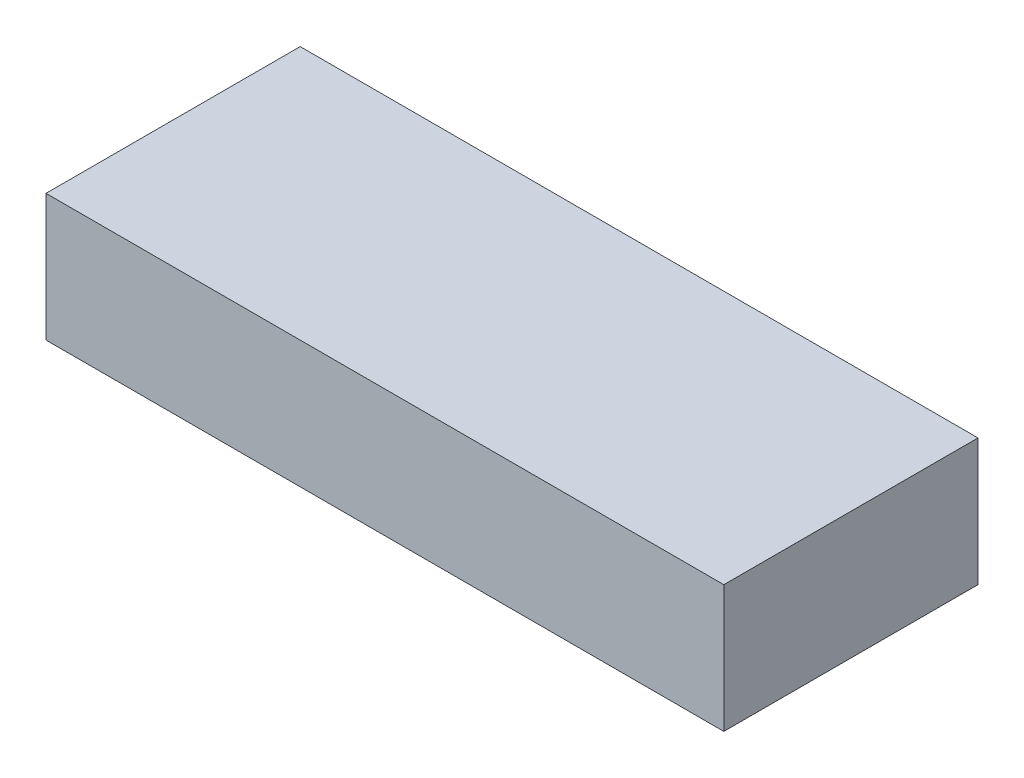
ISO-10303-21;
HEADER;
FILE_DESCRIPTION(('STEP AP214'),'2;1');
FILE_NAME('part.step','',(''),(''),'','','');
FILE_SCHEMA(('AUTOMOTIVE_DESIGN { 1 0 10303 214 1 1 1 1 }'));
ENDSEC;
DATA;
#1=APPLICATION_CONTEXT('core data for automotive mechanical design processes');
#2=APPLICATION_PROTOCOL_DEFINITION('international standard','automotive_design',2000,#1);
#3=PRODUCT_CONTEXT('',#1,'mechanical');
#4=PRODUCT('Part','Part','',(#3));
#5=PRODUCT_RELATED_PRODUCT_CATEGORY('part','',(#4));
#6=PRODUCT_DEFINITION_FORMATION('','',#4);
#7=PRODUCT_DEFINITION_CONTEXT('part definition',#1,'design');
#8=PRODUCT_DEFINITION('design','',#6,#7);
#9=PRODUCT_DEFINITION_SHAPE('','',#8);
#10=(LENGTH_UNIT() NAMED_UNIT(*) SI_UNIT(.MILLI.,.METRE.));
#11=(NAMED_UNIT(*) PLANE_ANGLE_UNIT() SI_UNIT($,.RADIAN.));
#12=(NAMED_UNIT(*) SI_UNIT($,.STERADIAN.) SOLID_ANGLE_UNIT());
#13=UNCERTAINTY_MEASURE_WITH_UNIT(LENGTH_MEASURE(1.E-05),#10,'distance_accuracy_value','');
#14=(GEOMETRIC_REPRESENTATION_CONTEXT(3) GLOBAL_UNCERTAINTY_ASSIGNED_CONTEXT((#13)) GLOBAL_UNIT_ASSIGNED_CONTEXT((#10,
#11,#12)) REPRESENTATION_CONTEXT('',''));
#15=CARTESIAN_POINT('',(0.,0.,0.));
#16=DIRECTION('',(0.,0.,1.));
#17=DIRECTION('',(1.,0.,0.));
#18=AXIS2_PLACEMENT_3D('',#15,#16,#17);
#19=CARTESIAN_POINT('',(4.,23.25,-17.));
#20=DIRECTION('',(0.,0.,1.));
#21=DIRECTION('',(1.,0.,0.));
#22=AXIS2_PLACEMENT_3D('',#19,#20,#21);
#23=PLANE('',#22);
#24=DIRECTION('',(-1.,0.,0.));
#25=VECTOR('',#24,1.);
#26=CARTESIAN_POINT('',(4.,21.75,-17.));
#27=LINE('',#26,#25);
#28=CARTESIAN_POINT('',(4.,21.75,-17.));
#29=VERTEX_POINT('',#28);
#30=CARTESIAN_POINT('',(-4.,21.75,-17.));
#31=VERTEX_POINT('',#30);
#32=EDGE_CURVE('E108',#29,#31,#27,.T.);
#33=ORIENTED_EDGE('',*,*,#32,.T.);
#34=DIRECTION('',(0.,-1.,0.));
#35=VECTOR('',#34,1.);
#36=CARTESIAN_POINT('',(-4.,23.25,-17.));
#37=LINE('',#36,#35);
#38=CARTESIAN_POINT('',(-4.,23.25,-17.));
#39=VERTEX_POINT('',#38);
#40=EDGE_CURVE('E11',#39,#31,#37,.T.);
#41=ORIENTED_EDGE('',*,*,#40,.F.);
#42=DIRECTION('',(-1.,0.,0.));
#43=VECTOR('',#42,1.);
#44=CARTESIAN_POINT('',(4.,23.25,-17.));
#45=LINE('',#44,#43);
#46=CARTESIAN_POINT('',(4.,23.25,-17.));
#47=VERTEX_POINT('',#46);
#48=EDGE_CURVE('E91',#47,#39,#45,.T.);
#49=ORIENTED_EDGE('',*,*,#48,.F.);
#50=DIRECTION('',(0.,-1.,0.));
#51=VECTOR('',#50,1.);
#52=CARTESIAN_POINT('',(4.,23.25,-17.));
#53=LINE('',#52,#51);
#54=EDGE_CURVE('E104',#47,#29,#53,.T.);
#55=ORIENTED_EDGE('',*,*,#54,.T.);
#56=EDGE_LOOP('',(#33,#41,#49,#55));
#57=FACE_BOUND('',#56,.T.);
#58=ADVANCED_FACE('F17',(#57),#23,.F.);
#59=CARTESIAN_POINT('',(-4.,23.25,-17.));
#60=DIRECTION('',(1.,0.,0.));
#61=DIRECTION('',(0.,0.,-1.));
#62=AXIS2_PLACEMENT_3D('',#59,#60,#61);
#63=PLANE('',#62);
#64=DIRECTION('',(0.,0.,1.));
#65=VECTOR('',#64,1.);
#66=CARTESIAN_POINT('',(-4.,21.75,-17.));
#67=LINE('',#66,#65);
#68=CARTESIAN_POINT('',(-4.,21.75,-14.));
#69=VERTEX_POINT('',#68);
#70=EDGE_CURVE('E96',#31,#69,#67,.T.);
#71=ORIENTED_EDGE('',*,*,#70,.T.);
#72=DIRECTION('',(0.,-1.,0.));
#73=VECTOR('',#72,1.);
#74=CARTESIAN_POINT('',(-4.,23.25,-14.));
#75=LINE('',#74,#73);
#76=CARTESIAN_POINT('',(-4.,23.25,-14.));
#77=VERTEX_POINT('',#76);
#78=EDGE_CURVE('E26',#77,#69,#75,.T.);
#79=ORIENTED_EDGE('',*,*,#78,.F.);
#80=DIRECTION('',(0.,0.,1.));
#81=VECTOR('',#80,1.);
#82=CARTESIAN_POINT('',(-4.,23.25,-17.));
#83=LINE('',#82,#81);
#84=EDGE_CURVE('E84',#39,#77,#83,.T.);
#85=ORIENTED_EDGE('',*,*,#84,.F.);
#86=ORIENTED_EDGE('',*,*,#40,.T.);
#87=EDGE_LOOP('',(#71,#79,#85,#86));
#88=FACE_BOUND('',#87,.T.);
#89=ADVANCED_FACE('F95',(#88),#63,.F.);
#90=CARTESIAN_POINT('',(-4.,23.25,-14.));
#91=DIRECTION('',(0.,0.,-1.));
#92=DIRECTION('',(-1.,0.,0.));
#93=AXIS2_PLACEMENT_3D('',#90,#91,#92);
#94=PLANE('',#93);
#95=DIRECTION('',(1.,0.,0.));
#96=VECTOR('',#95,1.);
#97=CARTESIAN_POINT('',(-4.,21.75,-14.));
#98=LINE('',#97,#96);
#99=CARTESIAN_POINT('',(4.,21.75,-14.));
#100=VERTEX_POINT('',#99);
#101=EDGE_CURVE('E63',#69,#100,#98,.T.);
#102=ORIENTED_EDGE('',*,*,#101,.T.);
#103=DIRECTION('',(0.,-1.,0.));
#104=VECTOR('',#103,1.);
#105=CARTESIAN_POINT('',(4.,23.25,-14.));
#106=LINE('',#105,#104);
#107=CARTESIAN_POINT('',(4.,23.25,-14.));
#108=VERTEX_POINT('',#107);
#109=EDGE_CURVE('E98',#108,#100,#106,.T.);
#110=ORIENTED_EDGE('',*,*,#109,.F.);
#111=DIRECTION('',(1.,0.,0.));
#112=VECTOR('',#111,1.);
#113=CARTESIAN_POINT('',(-4.,23.25,-14.));
#114=LINE('',#113,#112);
#115=EDGE_CURVE('E89',#77,#108,#114,.T.);
#116=ORIENTED_EDGE('',*,*,#115,.F.);
#117=ORIENTED_EDGE('',*,*,#78,.T.);
#118=EDGE_LOOP('',(#102,#110,#116,#117));
#119=FACE_BOUND('',#118,.T.);
#120=ADVANCED_FACE('F99',(#119),#94,.F.);
#121=CARTESIAN_POINT('',(4.,23.25,-14.));
#122=DIRECTION('',(-1.,0.,0.));
#123=DIRECTION('',(0.,0.,1.));
#124=AXIS2_PLACEMENT_3D('',#121,#122,#123);
#125=PLANE('',#124);
#126=DIRECTION('',(0.,0.,-1.));
#127=VECTOR('',#126,1.);
#128=CARTESIAN_POINT('',(4.,21.75,-14.));
#129=LINE('',#128,#127);
#130=EDGE_CURVE('E72',#100,#29,#129,.T.);
#131=ORIENTED_EDGE('',*,*,#130,.T.);
#132=ORIENTED_EDGE('',*,*,#54,.F.);
#133=DIRECTION('',(0.,0.,-1.));
#134=VECTOR('',#133,1.);
#135=CARTESIAN_POINT('',(4.,23.25,-14.));
#136=LINE('',#135,#134);
#137=EDGE_CURVE('E40',#108,#47,#136,.T.);
#138=ORIENTED_EDGE('',*,*,#137,.F.);
#139=ORIENTED_EDGE('',*,*,#109,.T.);
#140=EDGE_LOOP('',(#131,#132,#138,#139));
#141=FACE_BOUND('',#140,.T.);
#142=ADVANCED_FACE('F122',(#141),#125,.F.);
#143=CARTESIAN_POINT('',(-4.,23.25,-17.));
#144=DIRECTION('',(0.,1.,0.));
#145=DIRECTION('',(0.,0.,1.));
#146=AXIS2_PLACEMENT_3D('',#143,#144,#145);
#147=PLANE('',#146);
#148=ORIENTED_EDGE('',*,*,#48,.T.);
#149=ORIENTED_EDGE('',*,*,#84,.T.);
#150=ORIENTED_EDGE('',*,*,#115,.T.);
#151=ORIENTED_EDGE('',*,*,#137,.T.);
#152=EDGE_LOOP('',(#148,#149,#150,#151));
#153=FACE_BOUND('',#152,.T.);
#154=ADVANCED_FACE('F87',(#153),#147,.T.);
#155=CARTESIAN_POINT('',(-4.,21.75,-17.));
#156=DIRECTION('',(0.,1.,0.));
#157=DIRECTION('',(0.,0.,1.));
#158=AXIS2_PLACEMENT_3D('',#155,#156,#157);
#159=PLANE('',#158);
#160=ORIENTED_EDGE('',*,*,#32,.F.);
#161=ORIENTED_EDGE('',*,*,#130,.F.);
#162=ORIENTED_EDGE('',*,*,#101,.F.);
#163=ORIENTED_EDGE('',*,*,#70,.F.);
#164=EDGE_LOOP('',(#160,#161,#162,#163));
#165=FACE_BOUND('',#164,.T.);
#166=ADVANCED_FACE('F125',(#165),#159,.F.);
#167=CLOSED_SHELL('',(#58,#89,#120,#142,#154,#166));
#168=MANIFOLD_SOLID_BREP('B1',#167);
#169=ADVANCED_BREP_SHAPE_REPRESENTATION('',(#18,#168),#14);
#170=SHAPE_DEFINITION_REPRESENTATION(#9,#169);
ENDSEC;
END-ISO-10303-21;
